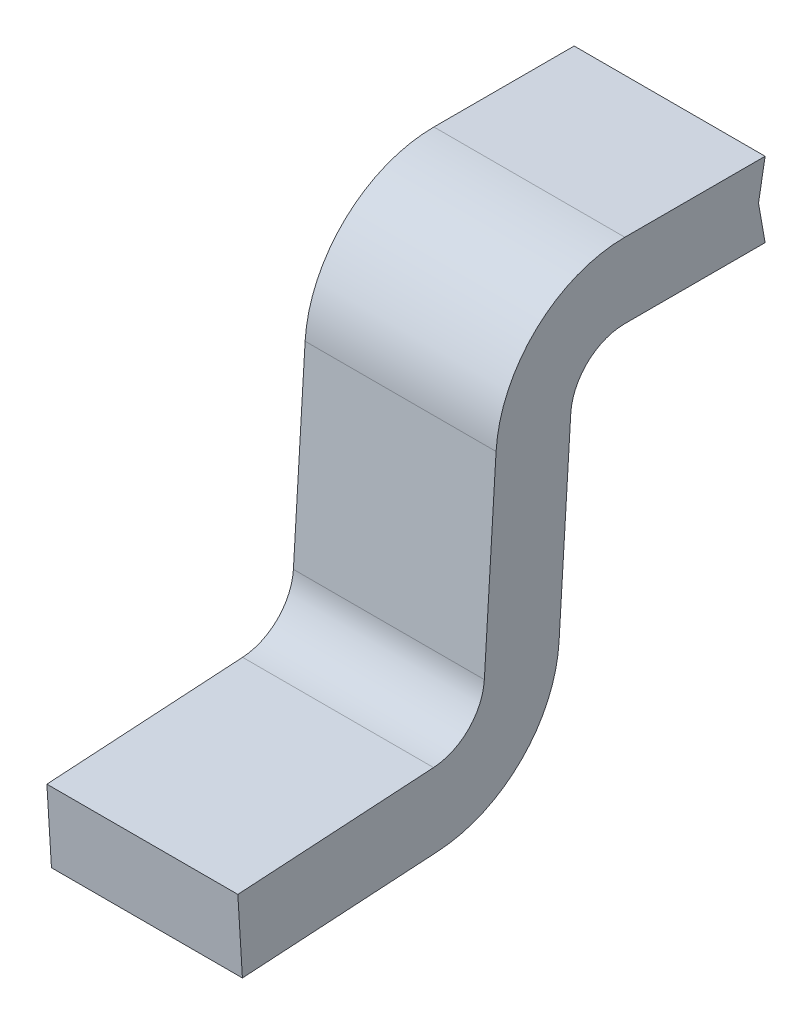
ISO-10303-21;
HEADER;
FILE_DESCRIPTION(('STEP AP214'),'2;1');
FILE_NAME('part.step','',(''),(''),'','','');
FILE_SCHEMA(('AUTOMOTIVE_DESIGN { 1 0 10303 214 1 1 1 1 }'));
ENDSEC;
DATA;
#1=APPLICATION_CONTEXT('core data for automotive mechanical design processes');
#2=APPLICATION_PROTOCOL_DEFINITION('international standard','automotive_design',2000,#1);
#3=PRODUCT_CONTEXT('',#1,'mechanical');
#4=PRODUCT('Part','Part','',(#3));
#5=PRODUCT_RELATED_PRODUCT_CATEGORY('part','',(#4));
#6=PRODUCT_DEFINITION_FORMATION('','',#4);
#7=PRODUCT_DEFINITION_CONTEXT('part definition',#1,'design');
#8=PRODUCT_DEFINITION('design','',#6,#7);
#9=PRODUCT_DEFINITION_SHAPE('','',#8);
#10=(LENGTH_UNIT() NAMED_UNIT(*) SI_UNIT(.MILLI.,.METRE.));
#11=(NAMED_UNIT(*) PLANE_ANGLE_UNIT() SI_UNIT($,.RADIAN.));
#12=(NAMED_UNIT(*) SI_UNIT($,.STERADIAN.) SOLID_ANGLE_UNIT());
#13=UNCERTAINTY_MEASURE_WITH_UNIT(LENGTH_MEASURE(1.E-05),#10,'distance_accuracy_value','');
#14=(GEOMETRIC_REPRESENTATION_CONTEXT(3) GLOBAL_UNCERTAINTY_ASSIGNED_CONTEXT((#13)) GLOBAL_UNIT_ASSIGNED_CONTEXT((#10,
#11,#12)) REPRESENTATION_CONTEXT('',''));
#15=CARTESIAN_POINT('',(0.,0.,0.));
#16=DIRECTION('',(0.,0.,1.));
#17=DIRECTION('',(1.,0.,0.));
#18=AXIS2_PLACEMENT_3D('',#15,#16,#17);
#19=CARTESIAN_POINT('',(0.885000000000003,0.,-7.));
#20=DIRECTION('',(-1.,0.,0.));
#21=DIRECTION('',(0.,0.,1.));
#22=AXIS2_PLACEMENT_3D('',#19,#20,#21);
#23=PLANE('',#22);
#24=DIRECTION('',(0.,0.984807753012208,0.17364817766693));
#25=VECTOR('',#24,1.);
#26=CARTESIAN_POINT('',(0.885000000000005,0.700000000000019,0.));
#27=LINE('',#26,#25);
#28=CARTESIAN_POINT('',(0.885000000000005,0.700000000000019,0.));
#29=VERTEX_POINT('',#28);
#30=CARTESIAN_POINT('',(0.885000000000005,0.627500000000019,-0.0127837061013672));
#31=VERTEX_POINT('',#30);
#32=EDGE_CURVE('E155',#29,#31,#27,.F.);
#33=ORIENTED_EDGE('',*,*,#32,.F.);
#34=DIRECTION('',(0.,0.984807753012207,-0.173648177666939));
#35=VECTOR('',#34,1.);
#36=CARTESIAN_POINT('',(0.885000000000005,0.772500000000001,-0.0127837061013647));
#37=LINE('',#36,#35);
#38=CARTESIAN_POINT('',(0.885000000000005,0.772500000000001,-0.0127837061013647));
#39=VERTEX_POINT('',#38);
#40=EDGE_CURVE('E161',#39,#29,#37,.F.);
#41=ORIENTED_EDGE('',*,*,#40,.F.);
#42=DIRECTION('',(0.,0.,1.));
#43=VECTOR('',#42,1.);
#44=CARTESIAN_POINT('',(0.885000000000005,0.772500000000001,-0.0127837061013646));
#45=LINE('',#44,#43);
#46=CARTESIAN_POINT('',(0.885000000000005,0.772500000000001,0.258974576477626));
#47=VERTEX_POINT('',#46);
#48=EDGE_CURVE('E167',#47,#39,#45,.F.);
#49=ORIENTED_EDGE('',*,*,#48,.F.);
#50=CARTESIAN_POINT('',(0.885000000000005,0.522500000000001,0.258974576477626));
#51=DIRECTION('',(1.,0.,0.));
#52=DIRECTION('',(0.,0.,-1.));
#53=AXIS2_PLACEMENT_3D('',#50,#51,#52);
#54=CIRCLE('',#53,0.25);
#55=CARTESIAN_POINT('',(0.885000000000005,0.537762134883714,0.508508276083093));
#56=VERTEX_POINT('',#55);
#57=EDGE_CURVE('E171',#56,#47,#54,.F.);
#58=ORIENTED_EDGE('',*,*,#57,.F.);
#59=DIRECTION('',(0.,-0.998134798421867,0.0610485395348536));
#60=VECTOR('',#59,1.);
#61=CARTESIAN_POINT('',(0.885000000000005,0.772500000000001,0.49415109320405));
#62=LINE('',#61,#60);
#63=CARTESIAN_POINT('',(0.885000000000005,0.166318378721913,0.531226749448484));
#64=VERTEX_POINT('',#63);
#65=EDGE_CURVE('E87',#64,#56,#62,.F.);
#66=ORIENTED_EDGE('',*,*,#65,.F.);
#67=CARTESIAN_POINT('',(0.885000000000005,0.172728475373073,0.636030903282781));
#68=DIRECTION('',(-1.,0.,0.));
#69=DIRECTION('',(0.,0.,1.));
#70=AXIS2_PLACEMENT_3D('',#67,#68,#69);
#71=CIRCLE('',#70,0.105);
#72=CARTESIAN_POINT('',(0.885000000000005,0.0679243215387768,0.629620806631622));
#73=VERTEX_POINT('',#72);
#74=EDGE_CURVE('E19',#64,#73,#71,.T.);
#75=ORIENTED_EDGE('',*,*,#74,.T.);
#76=DIRECTION('',(0.,-0.0610485395348497,0.998134798421867));
#77=VECTOR('',#76,1.);
#78=CARTESIAN_POINT('',(0.885000000000005,0.0735954959943027,0.536897923904011));
#79=LINE('',#78,#77);
#80=CARTESIAN_POINT('',(0.885000000000005,0.0447295457711714,1.00885203823255));
#81=VERTEX_POINT('',#80);
#82=EDGE_CURVE('E114',#81,#73,#79,.F.);
#83=ORIENTED_EDGE('',*,*,#82,.F.);
#84=DIRECTION('',(0.,-0.998134798421868,-0.0610485395348462));
#85=VECTOR('',#84,1.);
#86=CARTESIAN_POINT('',(0.885000000000005,0.0447295457711715,1.00885203823255));
#87=LINE('',#86,#85);
#88=CARTESIAN_POINT('',(0.885000000000005,-0.0999999999999994,0.999999999999997));
#89=VERTEX_POINT('',#88);
#90=EDGE_CURVE('E98',#89,#81,#87,.F.);
#91=ORIENTED_EDGE('',*,*,#90,.F.);
#92=DIRECTION('',(0.,0.0610485395348498,-0.998134798421867));
#93=VECTOR('',#92,1.);
#94=CARTESIAN_POINT('',(0.885000000000005,-0.0999999999999994,0.999999999999997));
#95=LINE('',#94,#93);
#96=CARTESIAN_POINT('',(0.885000000000005,-0.076805224232394,0.62076876839907));
#97=VERTEX_POINT('',#96);
#98=EDGE_CURVE('E138',#97,#89,#95,.F.);
#99=ORIENTED_EDGE('',*,*,#98,.F.);
#100=CARTESIAN_POINT('',(0.885000000000005,0.172728475373073,0.636030903282782));
#101=DIRECTION('',(1.,0.,0.));
#102=DIRECTION('',(0.,0.,-1.));
#103=AXIS2_PLACEMENT_3D('',#100,#101,#102);
#104=CIRCLE('',#103,0.25);
#105=CARTESIAN_POINT('',(0.885000000000005,0.157466340489359,0.386497203677315));
#106=VERTEX_POINT('',#105);
#107=EDGE_CURVE('E192',#106,#97,#104,.F.);
#108=ORIENTED_EDGE('',*,*,#107,.F.);
#109=DIRECTION('',(0.,0.998134798421867,-0.0610485395348541));
#110=VECTOR('',#109,1.);
#111=CARTESIAN_POINT('',(0.885000000000005,-0.063302427909713,0.399999999999997));
#112=LINE('',#111,#110);
#113=CARTESIAN_POINT('',(0.885000000000005,0.528910096651165,0.363778730311922));
#114=VERTEX_POINT('',#113);
#115=EDGE_CURVE('E144',#114,#106,#112,.F.);
#116=ORIENTED_EDGE('',*,*,#115,.F.);
#117=CARTESIAN_POINT('',(0.885000000000005,0.522500000000006,0.258974576477626));
#118=DIRECTION('',(-1.,0.,0.));
#119=DIRECTION('',(0.,0.,1.));
#120=AXIS2_PLACEMENT_3D('',#117,#118,#119);
#121=CIRCLE('',#120,0.105);
#122=CARTESIAN_POINT('',(0.885000000000005,0.627500000000006,0.258974576477632));
#123=VERTEX_POINT('',#122);
#124=EDGE_CURVE('E151',#114,#123,#121,.T.);
#125=ORIENTED_EDGE('',*,*,#124,.T.);
#126=DIRECTION('',(0.,0.,-1.));
#127=VECTOR('',#126,1.);
#128=CARTESIAN_POINT('',(0.885000000000005,0.627500000000001,0.357748713502725));
#129=LINE('',#128,#127);
#130=EDGE_CURVE('E148',#31,#123,#129,.F.);
#131=ORIENTED_EDGE('',*,*,#130,.F.);
#132=EDGE_LOOP('',(#33,#41,#49,#58,#66,#75,#83,#91,#99,#108,#116,#125,#131));
#133=FACE_BOUND('',#132,.T.);
#134=ADVANCED_FACE('F16',(#133),#23,.F.);
#135=CARTESIAN_POINT('',(0.515000000000004,-0.0999999999999994,0.999999999999997));
#136=DIRECTION('',(0.,-0.998134798421867,-0.0610485395348498));
#137=DIRECTION('',(0.,0.0610485395348498,-0.998134798421867));
#138=AXIS2_PLACEMENT_3D('',#135,#136,#137);
#139=PLANE('',#138);
#140=DIRECTION('',(0.,-0.06104853953485,0.998134798421867));
#141=VECTOR('',#140,1.);
#142=CARTESIAN_POINT('',(0.515000000000004,-0.0768052242323942,0.62076876839907));
#143=LINE('',#142,#141);
#144=CARTESIAN_POINT('',(0.515000000000004,-0.0768052242323942,0.62076876839907));
#145=VERTEX_POINT('',#144);
#146=CARTESIAN_POINT('',(0.515000000000004,-0.0999999999999994,0.999999999999997));
#147=VERTEX_POINT('',#146);
#148=EDGE_CURVE('E128',#145,#147,#143,.T.);
#149=ORIENTED_EDGE('',*,*,#148,.F.);
#150=DIRECTION('',(1.,0.,0.));
#151=VECTOR('',#150,1.);
#152=CARTESIAN_POINT('',(0.515000000000004,-0.0768052242323939,0.62076876839907));
#153=LINE('',#152,#151);
#154=EDGE_CURVE('E130',#97,#145,#153,.F.);
#155=ORIENTED_EDGE('',*,*,#154,.F.);
#156=ORIENTED_EDGE('',*,*,#98,.T.);
#157=DIRECTION('',(1.,0.,0.));
#158=VECTOR('',#157,1.);
#159=CARTESIAN_POINT('',(0.515000000000004,-0.0999999999999994,0.999999999999997));
#160=LINE('',#159,#158);
#161=EDGE_CURVE('E104',#147,#89,#160,.T.);
#162=ORIENTED_EDGE('',*,*,#161,.F.);
#163=EDGE_LOOP('',(#149,#155,#156,#162));
#164=FACE_BOUND('',#163,.T.);
#165=ADVANCED_FACE('F396',(#164),#139,.T.);
#166=CARTESIAN_POINT('',(0.515000000000004,0.0447295457711715,1.00885203823255));
#167=DIRECTION('',(0.,-0.0610485395348462,0.998134798421868));
#168=DIRECTION('',(0.,-0.998134798421868,-0.0610485395348462));
#169=AXIS2_PLACEMENT_3D('',#166,#167,#168);
#170=PLANE('',#169);
#171=ORIENTED_EDGE('',*,*,#161,.T.);
#172=ORIENTED_EDGE('',*,*,#90,.T.);
#173=DIRECTION('',(1.,0.,0.));
#174=VECTOR('',#173,1.);
#175=CARTESIAN_POINT('',(0.515000000000004,0.0447295457711714,1.00885203823255));
#176=LINE('',#175,#174);
#177=CARTESIAN_POINT('',(0.515000000000004,0.0447295457711715,1.00885203823255));
#178=VERTEX_POINT('',#177);
#179=EDGE_CURVE('E107',#178,#81,#176,.T.);
#180=ORIENTED_EDGE('',*,*,#179,.F.);
#181=DIRECTION('',(0.,0.998134798421867,0.0610485395348462));
#182=VECTOR('',#181,1.);
#183=CARTESIAN_POINT('',(0.515000000000004,-0.0999999999999994,0.999999999999997));
#184=LINE('',#183,#182);
#185=EDGE_CURVE('E111',#147,#178,#184,.T.);
#186=ORIENTED_EDGE('',*,*,#185,.F.);
#187=EDGE_LOOP('',(#171,#172,#180,#186));
#188=FACE_BOUND('',#187,.T.);
#189=ADVANCED_FACE('F109',(#188),#170,.T.);
#190=CARTESIAN_POINT('',(0.515000000000004,0.0735954959943027,0.536897923904011));
#191=DIRECTION('',(0.,0.998134798421867,0.0610485395348497));
#192=DIRECTION('',(0.,-0.0610485395348497,0.998134798421867));
#193=AXIS2_PLACEMENT_3D('',#190,#191,#192);
#194=PLANE('',#193);
#195=ORIENTED_EDGE('',*,*,#82,.T.);
#196=DIRECTION('',(-1.,0.,0.));
#197=VECTOR('',#196,1.);
#198=CARTESIAN_POINT('',(0.515000000000004,0.0679243215387769,0.629620806631622));
#199=LINE('',#198,#197);
#200=CARTESIAN_POINT('',(0.515000000000004,0.0679243215387767,0.629620806631622));
#201=VERTEX_POINT('',#200);
#202=EDGE_CURVE('E120',#73,#201,#199,.T.);
#203=ORIENTED_EDGE('',*,*,#202,.T.);
#204=DIRECTION('',(0.,0.0610485395348496,-0.998134798421867));
#205=VECTOR('',#204,1.);
#206=CARTESIAN_POINT('',(0.515000000000004,0.0447295457711715,1.00885203823255));
#207=LINE('',#206,#205);
#208=EDGE_CURVE('E117',#178,#201,#207,.T.);
#209=ORIENTED_EDGE('',*,*,#208,.F.);
#210=ORIENTED_EDGE('',*,*,#179,.T.);
#211=EDGE_LOOP('',(#195,#203,#209,#210));
#212=FACE_BOUND('',#211,.T.);
#213=ADVANCED_FACE('F118',(#212),#194,.T.);
#214=CARTESIAN_POINT('',(0.515000000000004,0.172728475373073,0.636030903282781));
#215=DIRECTION('',(-1.,0.,0.));
#216=DIRECTION('',(0.,0.,1.));
#217=AXIS2_PLACEMENT_3D('',#214,#215,#216);
#218=CYLINDRICAL_SURFACE('',#217,0.105);
#219=ORIENTED_EDGE('',*,*,#202,.F.);
#220=ORIENTED_EDGE('',*,*,#74,.F.);
#221=DIRECTION('',(1.,0.,0.));
#222=VECTOR('',#221,1.);
#223=CARTESIAN_POINT('',(0.515000000000004,0.166318378721913,0.531226749448484));
#224=LINE('',#223,#222);
#225=CARTESIAN_POINT('',(0.515000000000004,0.166318378721913,0.531226749448485));
#226=VERTEX_POINT('',#225);
#227=EDGE_CURVE('E175',#226,#64,#224,.T.);
#228=ORIENTED_EDGE('',*,*,#227,.F.);
#229=CARTESIAN_POINT('',(0.515000000000004,0.172728475373073,0.636030903282781));
#230=DIRECTION('',(-1.,0.,0.));
#231=DIRECTION('',(0.,0.,1.));
#232=AXIS2_PLACEMENT_3D('',#229,#230,#231);
#233=CIRCLE('',#232,0.105);
#234=EDGE_CURVE('E124',#201,#226,#233,.F.);
#235=ORIENTED_EDGE('',*,*,#234,.F.);
#236=EDGE_LOOP('',(#219,#220,#228,#235));
#237=FACE_BOUND('',#236,.T.);
#238=ADVANCED_FACE('F292',(#237),#218,.F.);
#239=CARTESIAN_POINT('',(0.515000000000004,0.772500000000001,0.49415109320405));
#240=DIRECTION('',(0.,0.0610485395348536,0.998134798421867));
#241=DIRECTION('',(0.,-0.998134798421867,0.0610485395348536));
#242=AXIS2_PLACEMENT_3D('',#239,#240,#241);
#243=PLANE('',#242);
#244=DIRECTION('',(0.,0.998134798421867,-0.0610485395348548));
#245=VECTOR('',#244,1.);
#246=CARTESIAN_POINT('',(0.515000000000004,0.166318378721913,0.531226749448485));
#247=LINE('',#246,#245);
#248=CARTESIAN_POINT('',(0.515000000000004,0.537762134883714,0.508508276083093));
#249=VERTEX_POINT('',#248);
#250=EDGE_CURVE('E190',#226,#249,#247,.T.);
#251=ORIENTED_EDGE('',*,*,#250,.F.);
#252=ORIENTED_EDGE('',*,*,#227,.T.);
#253=ORIENTED_EDGE('',*,*,#65,.T.);
#254=DIRECTION('',(1.,0.,0.));
#255=VECTOR('',#254,1.);
#256=CARTESIAN_POINT('',(0.515000000000004,0.537762134883714,0.508508276083093));
#257=LINE('',#256,#255);
#258=EDGE_CURVE('E196',#249,#56,#257,.T.);
#259=ORIENTED_EDGE('',*,*,#258,.F.);
#260=EDGE_LOOP('',(#251,#252,#253,#259));
#261=FACE_BOUND('',#260,.T.);
#262=ADVANCED_FACE('F284',(#261),#243,.T.);
#263=CARTESIAN_POINT('',(0.515000000000004,0.522500000000001,0.258974576477626));
#264=DIRECTION('',(1.,0.,0.));
#265=DIRECTION('',(0.,0.,-1.));
#266=AXIS2_PLACEMENT_3D('',#263,#264,#265);
#267=CYLINDRICAL_SURFACE('',#266,0.25);
#268=ORIENTED_EDGE('',*,*,#57,.T.);
#269=DIRECTION('',(1.,0.,0.));
#270=VECTOR('',#269,1.);
#271=CARTESIAN_POINT('',(0.515000000000004,0.772500000000001,0.258974576477626));
#272=LINE('',#271,#270);
#273=CARTESIAN_POINT('',(0.515000000000004,0.772500000000001,0.258974576477626));
#274=VERTEX_POINT('',#273);
#275=EDGE_CURVE('E170',#274,#47,#272,.T.);
#276=ORIENTED_EDGE('',*,*,#275,.F.);
#277=CARTESIAN_POINT('',(0.515000000000004,0.522500000000001,0.258974576477626));
#278=DIRECTION('',(1.,0.,0.));
#279=DIRECTION('',(0.,0.,-1.));
#280=AXIS2_PLACEMENT_3D('',#277,#278,#279);
#281=CIRCLE('',#280,0.25);
#282=EDGE_CURVE('E186',#249,#274,#281,.F.);
#283=ORIENTED_EDGE('',*,*,#282,.F.);
#284=ORIENTED_EDGE('',*,*,#258,.T.);
#285=EDGE_LOOP('',(#268,#276,#283,#284));
#286=FACE_BOUND('',#285,.T.);
#287=ADVANCED_FACE('F282',(#286),#267,.T.);
#288=CARTESIAN_POINT('',(0.515000000000004,0.772500000000001,-0.0127837061013646));
#289=DIRECTION('',(0.,1.,0.));
#290=DIRECTION('',(0.,0.,1.));
#291=AXIS2_PLACEMENT_3D('',#288,#289,#290);
#292=PLANE('',#291);
#293=DIRECTION('',(0.,0.,1.));
#294=VECTOR('',#293,1.);
#295=CARTESIAN_POINT('',(0.515000000000002,0.772500000000001,-7.));
#296=LINE('',#295,#294);
#297=CARTESIAN_POINT('',(0.515000000000004,0.772500000000001,-0.0127837061013649));
#298=VERTEX_POINT('',#297);
#299=EDGE_CURVE('E189',#274,#298,#296,.F.);
#300=ORIENTED_EDGE('',*,*,#299,.F.);
#301=ORIENTED_EDGE('',*,*,#275,.T.);
#302=ORIENTED_EDGE('',*,*,#48,.T.);
#303=DIRECTION('',(1.,0.,0.));
#304=VECTOR('',#303,1.);
#305=CARTESIAN_POINT('',(0.515000000000004,0.772500000000001,-0.0127837061013646));
#306=LINE('',#305,#304);
#307=EDGE_CURVE('E164',#298,#39,#306,.T.);
#308=ORIENTED_EDGE('',*,*,#307,.F.);
#309=EDGE_LOOP('',(#300,#301,#302,#308));
#310=FACE_BOUND('',#309,.T.);
#311=ADVANCED_FACE('F277',(#310),#292,.T.);
#312=CARTESIAN_POINT('',(0.515000000000004,0.772500000000001,-0.0127837061013646));
#313=DIRECTION('',(0.,-0.173648177666939,-0.984807753012207));
#314=DIRECTION('',(0.,0.984807753012207,-0.173648177666939));
#315=AXIS2_PLACEMENT_3D('',#312,#313,#314);
#316=PLANE('',#315);
#317=ORIENTED_EDGE('',*,*,#307,.T.);
#318=ORIENTED_EDGE('',*,*,#40,.T.);
#319=DIRECTION('',(1.,0.,0.));
#320=VECTOR('',#319,1.);
#321=CARTESIAN_POINT('',(0.515000000000004,0.700000000000019,0.));
#322=LINE('',#321,#320);
#323=CARTESIAN_POINT('',(0.515000000000004,0.700000000000019,0.));
#324=VERTEX_POINT('',#323);
#325=EDGE_CURVE('E158',#324,#29,#322,.T.);
#326=ORIENTED_EDGE('',*,*,#325,.F.);
#327=DIRECTION('',(0.,-0.984807753012207,0.173648177666938));
#328=VECTOR('',#327,1.);
#329=CARTESIAN_POINT('',(0.515000000000004,0.772500000000001,-0.0127837061013646));
#330=LINE('',#329,#328);
#331=EDGE_CURVE('E213',#298,#324,#330,.T.);
#332=ORIENTED_EDGE('',*,*,#331,.F.);
#333=EDGE_LOOP('',(#317,#318,#326,#332));
#334=FACE_BOUND('',#333,.T.);
#335=ADVANCED_FACE('F280',(#334),#316,.T.);
#336=CARTESIAN_POINT('',(0.515000000000004,0.700000000000019,0.));
#337=DIRECTION('',(0.,0.17364817766693,-0.984807753012208));
#338=DIRECTION('',(0.,0.984807753012208,0.17364817766693));
#339=AXIS2_PLACEMENT_3D('',#336,#337,#338);
#340=PLANE('',#339);
#341=ORIENTED_EDGE('',*,*,#325,.T.);
#342=ORIENTED_EDGE('',*,*,#32,.T.);
#343=DIRECTION('',(1.,0.,0.));
#344=VECTOR('',#343,1.);
#345=CARTESIAN_POINT('',(0.515000000000004,0.627500000000019,-0.0127837061013672));
#346=LINE('',#345,#344);
#347=CARTESIAN_POINT('',(0.515000000000004,0.627500000000019,-0.0127837061013672));
#348=VERTEX_POINT('',#347);
#349=EDGE_CURVE('E152',#348,#31,#346,.T.);
#350=ORIENTED_EDGE('',*,*,#349,.F.);
#351=DIRECTION('',(0.,-0.984807753012208,-0.173648177666931));
#352=VECTOR('',#351,1.);
#353=CARTESIAN_POINT('',(0.515000000000004,0.700000000000019,0.));
#354=LINE('',#353,#352);
#355=EDGE_CURVE('E216',#324,#348,#354,.T.);
#356=ORIENTED_EDGE('',*,*,#355,.F.);
#357=EDGE_LOOP('',(#341,#342,#350,#356));
#358=FACE_BOUND('',#357,.T.);
#359=ADVANCED_FACE('F266',(#358),#340,.T.);
#360=CARTESIAN_POINT('',(0.515000000000004,0.627500000000001,0.357748713502725));
#361=DIRECTION('',(0.,-1.,0.));
#362=DIRECTION('',(0.,0.,-1.));
#363=AXIS2_PLACEMENT_3D('',#360,#361,#362);
#364=PLANE('',#363);
#365=ORIENTED_EDGE('',*,*,#130,.T.);
#366=DIRECTION('',(-1.,0.,0.));
#367=VECTOR('',#366,1.);
#368=CARTESIAN_POINT('',(0.515000000000004,0.627500000000006,0.258974576477632));
#369=LINE('',#368,#367);
#370=CARTESIAN_POINT('',(0.515000000000004,0.627500000000012,0.258974576477629));
#371=VERTEX_POINT('',#370);
#372=EDGE_CURVE('E147',#123,#371,#369,.T.);
#373=ORIENTED_EDGE('',*,*,#372,.T.);
#374=DIRECTION('',(0.,0.,1.));
#375=VECTOR('',#374,1.);
#376=CARTESIAN_POINT('',(0.515000000000002,0.627500000000019,-7.));
#377=LINE('',#376,#375);
#378=EDGE_CURVE('E185',#348,#371,#377,.T.);
#379=ORIENTED_EDGE('',*,*,#378,.F.);
#380=ORIENTED_EDGE('',*,*,#349,.T.);
#381=EDGE_LOOP('',(#365,#373,#379,#380));
#382=FACE_BOUND('',#381,.T.);
#383=ADVANCED_FACE('F259',(#382),#364,.T.);
#384=CARTESIAN_POINT('',(0.515000000000004,0.522500000000006,0.258974576477626));
#385=DIRECTION('',(-1.,0.,0.));
#386=DIRECTION('',(0.,0.,1.));
#387=AXIS2_PLACEMENT_3D('',#384,#385,#386);
#388=CYLINDRICAL_SURFACE('',#387,0.105);
#389=ORIENTED_EDGE('',*,*,#372,.F.);
#390=ORIENTED_EDGE('',*,*,#124,.F.);
#391=DIRECTION('',(1.,0.,0.));
#392=VECTOR('',#391,1.);
#393=CARTESIAN_POINT('',(0.515000000000004,0.528910096651165,0.363778730311922));
#394=LINE('',#393,#392);
#395=CARTESIAN_POINT('',(0.515000000000004,0.528910096651165,0.363778730311922));
#396=VERTEX_POINT('',#395);
#397=EDGE_CURVE('E146',#396,#114,#394,.T.);
#398=ORIENTED_EDGE('',*,*,#397,.F.);
#399=CARTESIAN_POINT('',(0.515000000000004,0.522500000000006,0.258974576477626));
#400=DIRECTION('',(-1.,0.,0.));
#401=DIRECTION('',(0.,0.,1.));
#402=AXIS2_PLACEMENT_3D('',#399,#400,#401);
#403=CIRCLE('',#402,0.105);
#404=EDGE_CURVE('E182',#371,#396,#403,.F.);
#405=ORIENTED_EDGE('',*,*,#404,.F.);
#406=EDGE_LOOP('',(#389,#390,#398,#405));
#407=FACE_BOUND('',#406,.T.);
#408=ADVANCED_FACE('F255',(#407),#388,.F.);
#409=CARTESIAN_POINT('',(0.515000000000004,-0.063302427909713,0.399999999999997));
#410=DIRECTION('',(0.,-0.0610485395348541,-0.998134798421867));
#411=DIRECTION('',(0.,0.998134798421867,-0.0610485395348541));
#412=AXIS2_PLACEMENT_3D('',#409,#410,#411);
#413=PLANE('',#412);
#414=DIRECTION('',(0.,-0.998134798421867,0.0610485395348563));
#415=VECTOR('',#414,1.);
#416=CARTESIAN_POINT('',(0.515000000000004,0.528910096651165,0.363778730311922));
#417=LINE('',#416,#415);
#418=CARTESIAN_POINT('',(0.515000000000004,0.157466340489359,0.386497203677315));
#419=VERTEX_POINT('',#418);
#420=EDGE_CURVE('E25',#396,#419,#417,.T.);
#421=ORIENTED_EDGE('',*,*,#420,.F.);
#422=ORIENTED_EDGE('',*,*,#397,.T.);
#423=ORIENTED_EDGE('',*,*,#115,.T.);
#424=DIRECTION('',(1.,0.,0.));
#425=VECTOR('',#424,1.);
#426=CARTESIAN_POINT('',(0.515000000000004,0.157466340489359,0.386497203677315));
#427=LINE('',#426,#425);
#428=EDGE_CURVE('E34',#419,#106,#427,.T.);
#429=ORIENTED_EDGE('',*,*,#428,.F.);
#430=EDGE_LOOP('',(#421,#422,#423,#429));
#431=FACE_BOUND('',#430,.T.);
#432=ADVANCED_FACE('F250',(#431),#413,.T.);
#433=CARTESIAN_POINT('',(0.515000000000004,0.172728475373073,0.636030903282782));
#434=DIRECTION('',(1.,0.,0.));
#435=DIRECTION('',(0.,0.,-1.));
#436=AXIS2_PLACEMENT_3D('',#433,#434,#435);
#437=CYLINDRICAL_SURFACE('',#436,0.25);
#438=ORIENTED_EDGE('',*,*,#107,.T.);
#439=ORIENTED_EDGE('',*,*,#154,.T.);
#440=CARTESIAN_POINT('',(0.515000000000004,0.172728475373073,0.636030903282782));
#441=DIRECTION('',(1.,0.,0.));
#442=DIRECTION('',(0.,0.,-1.));
#443=AXIS2_PLACEMENT_3D('',#440,#441,#442);
#444=CIRCLE('',#443,0.25);
#445=EDGE_CURVE('E11',#419,#145,#444,.F.);
#446=ORIENTED_EDGE('',*,*,#445,.F.);
#447=ORIENTED_EDGE('',*,*,#428,.T.);
#448=EDGE_LOOP('',(#438,#439,#446,#447));
#449=FACE_BOUND('',#448,.T.);
#450=ADVANCED_FACE('F296',(#449),#437,.T.);
#451=CARTESIAN_POINT('',(0.515000000000002,0.,-7.));
#452=DIRECTION('',(-1.,0.,0.));
#453=DIRECTION('',(0.,0.,1.));
#454=AXIS2_PLACEMENT_3D('',#451,#452,#453);
#455=PLANE('',#454);
#456=ORIENTED_EDGE('',*,*,#420,.T.);
#457=ORIENTED_EDGE('',*,*,#445,.T.);
#458=ORIENTED_EDGE('',*,*,#148,.T.);
#459=ORIENTED_EDGE('',*,*,#185,.T.);
#460=ORIENTED_EDGE('',*,*,#208,.T.);
#461=ORIENTED_EDGE('',*,*,#234,.T.);
#462=ORIENTED_EDGE('',*,*,#250,.T.);
#463=ORIENTED_EDGE('',*,*,#282,.T.);
#464=ORIENTED_EDGE('',*,*,#299,.T.);
#465=ORIENTED_EDGE('',*,*,#331,.T.);
#466=ORIENTED_EDGE('',*,*,#355,.T.);
#467=ORIENTED_EDGE('',*,*,#378,.T.);
#468=ORIENTED_EDGE('',*,*,#404,.T.);
#469=EDGE_LOOP('',(#456,#457,#458,#459,#460,#461,#462,#463,#464,#465,#466,#467,#468));
#470=FACE_BOUND('',#469,.T.);
#471=ADVANCED_FACE('F127',(#470),#455,.T.);
#472=CLOSED_SHELL('',(#134,#165,#189,#213,#238,#262,#287,#311,#335,#359,#383,#408,#432,#450,#471));
#473=MANIFOLD_SOLID_BREP('B1',#472);
#474=ADVANCED_BREP_SHAPE_REPRESENTATION('',(#18,#473),#14);
#475=SHAPE_DEFINITION_REPRESENTATION(#9,#474);
ENDSEC;
END-ISO-10303-21;
